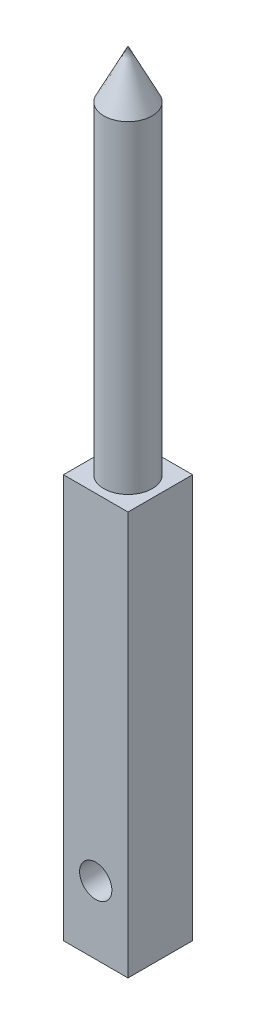
ISO-10303-21;
HEADER;
FILE_DESCRIPTION(('STEP AP214'),'2;1');
FILE_NAME('part.step','',(''),(''),'','','');
FILE_SCHEMA(('AUTOMOTIVE_DESIGN { 1 0 10303 214 1 1 1 1 }'));
ENDSEC;
DATA;
#1=APPLICATION_CONTEXT('core data for automotive mechanical design processes');
#2=APPLICATION_PROTOCOL_DEFINITION('international standard','automotive_design',2000,#1);
#3=PRODUCT_CONTEXT('',#1,'mechanical');
#4=PRODUCT('Part','Part','',(#3));
#5=PRODUCT_RELATED_PRODUCT_CATEGORY('part','',(#4));
#6=PRODUCT_DEFINITION_FORMATION('','',#4);
#7=PRODUCT_DEFINITION_CONTEXT('part definition',#1,'design');
#8=PRODUCT_DEFINITION('design','',#6,#7);
#9=PRODUCT_DEFINITION_SHAPE('','',#8);
#10=(LENGTH_UNIT() NAMED_UNIT(*) SI_UNIT(.MILLI.,.METRE.));
#11=(NAMED_UNIT(*) PLANE_ANGLE_UNIT() SI_UNIT($,.RADIAN.));
#12=(NAMED_UNIT(*) SI_UNIT($,.STERADIAN.) SOLID_ANGLE_UNIT());
#13=UNCERTAINTY_MEASURE_WITH_UNIT(LENGTH_MEASURE(1.E-05),#10,'distance_accuracy_value','');
#14=(GEOMETRIC_REPRESENTATION_CONTEXT(3) GLOBAL_UNCERTAINTY_ASSIGNED_CONTEXT((#13)) GLOBAL_UNIT_ASSIGNED_CONTEXT((#10,
#11,#12)) REPRESENTATION_CONTEXT('',''));
#15=CARTESIAN_POINT('',(0.,0.,0.));
#16=DIRECTION('',(0.,0.,1.));
#17=DIRECTION('',(1.,0.,0.));
#18=AXIS2_PLACEMENT_3D('',#15,#16,#17);
#19=CARTESIAN_POINT('',(0.,-90.,0.));
#20=DIRECTION('',(0.,1.,0.));
#21=DIRECTION('',(0.,0.,1.));
#22=AXIS2_PLACEMENT_3D('',#19,#20,#21);
#23=CYLINDRICAL_SURFACE('',#22,3.);
#24=CARTESIAN_POINT('',(0.,0.,0.));
#25=DIRECTION('',(0.,-1.,0.));
#26=DIRECTION('',(0.,0.,-1.));
#27=AXIS2_PLACEMENT_3D('',#24,#25,#26);
#28=CIRCLE('',#27,3.);
#29=CARTESIAN_POINT('',(0.,0.,3.));
#30=VERTEX_POINT('',#29);
#31=EDGE_CURVE('E41',#30,#30,#28,.T.);
#32=CARTESIAN_POINT('',(0.,-40.,0.));
#33=DIRECTION('',(0.,-1.,0.));
#34=DIRECTION('',(0.,0.,-1.));
#35=AXIS2_PLACEMENT_3D('',#32,#33,#34);
#36=CIRCLE('',#35,3.);
#37=CARTESIAN_POINT('',(0.,-40.,3.));
#38=VERTEX_POINT('',#37);
#39=EDGE_CURVE('E11',#38,#38,#36,.T.);
#40=CARTESIAN_POINT('',(0.,0.,3.));
#41=CARTESIAN_POINT('',(0.,-0.416666666666653,3.));
#42=CARTESIAN_POINT('',(0.,-0.83333333333332,3.));
#43=CARTESIAN_POINT('',(0.,-1.66666666666665,3.));
#44=CARTESIAN_POINT('',(0.,-2.08333333333332,3.));
#45=CARTESIAN_POINT('',(0.,-2.91666666666665,3.));
#46=CARTESIAN_POINT('',(0.,-3.33333333333332,3.));
#47=CARTESIAN_POINT('',(0.,-4.16666666666666,3.));
#48=CARTESIAN_POINT('',(0.,-4.58333333333332,3.));
#49=CARTESIAN_POINT('',(0.,-5.41666666666666,3.));
#50=CARTESIAN_POINT('',(0.,-5.83333333333333,3.));
#51=CARTESIAN_POINT('',(0.,-6.66666666666665,3.));
#52=CARTESIAN_POINT('',(0.,-7.08333333333332,3.));
#53=CARTESIAN_POINT('',(0.,-7.91666666666665,3.));
#54=CARTESIAN_POINT('',(0.,-8.33333333333331,3.));
#55=CARTESIAN_POINT('',(0.,-9.16666666666665,3.));
#56=CARTESIAN_POINT('',(0.,-9.58333333333331,3.));
#57=CARTESIAN_POINT('',(0.,-10.4166666666666,3.));
#58=CARTESIAN_POINT('',(0.,-10.8333333333333,3.));
#59=CARTESIAN_POINT('',(0.,-11.6666666666667,3.));
#60=CARTESIAN_POINT('',(0.,-12.0833333333333,3.));
#61=CARTESIAN_POINT('',(0.,-12.9166666666667,3.));
#62=CARTESIAN_POINT('',(0.,-13.3333333333333,3.));
#63=CARTESIAN_POINT('',(0.,-14.1666666666667,3.));
#64=CARTESIAN_POINT('',(0.,-14.5833333333333,3.));
#65=CARTESIAN_POINT('',(0.,-15.4166666666667,3.));
#66=CARTESIAN_POINT('',(0.,-15.8333333333333,3.));
#67=CARTESIAN_POINT('',(0.,-16.6666666666667,3.));
#68=CARTESIAN_POINT('',(0.,-17.0833333333333,3.));
#69=CARTESIAN_POINT('',(0.,-17.9166666666667,3.));
#70=CARTESIAN_POINT('',(0.,-18.3333333333333,3.));
#71=CARTESIAN_POINT('',(0.,-19.1666666666666,3.));
#72=CARTESIAN_POINT('',(0.,-19.5833333333333,3.));
#73=CARTESIAN_POINT('',(0.,-20.4166666666666,3.));
#74=CARTESIAN_POINT('',(0.,-20.8333333333333,3.));
#75=CARTESIAN_POINT('',(0.,-21.6666666666666,3.));
#76=CARTESIAN_POINT('',(0.,-22.0833333333333,3.));
#77=CARTESIAN_POINT('',(0.,-22.9166666666666,3.));
#78=CARTESIAN_POINT('',(0.,-23.3333333333333,3.));
#79=CARTESIAN_POINT('',(0.,-24.1666666666666,3.));
#80=CARTESIAN_POINT('',(0.,-24.5833333333333,3.));
#81=CARTESIAN_POINT('',(0.,-25.4166666666666,3.));
#82=CARTESIAN_POINT('',(0.,-25.8333333333333,3.));
#83=CARTESIAN_POINT('',(0.,-26.6666666666666,3.));
#84=CARTESIAN_POINT('',(0.,-27.0833333333333,3.));
#85=CARTESIAN_POINT('',(0.,-27.9166666666667,3.));
#86=CARTESIAN_POINT('',(0.,-28.3333333333333,3.));
#87=CARTESIAN_POINT('',(0.,-29.1666666666666,3.));
#88=CARTESIAN_POINT('',(0.,-29.5833333333333,3.));
#89=CARTESIAN_POINT('',(0.,-30.4166666666666,3.));
#90=CARTESIAN_POINT('',(0.,-30.8333333333333,3.));
#91=CARTESIAN_POINT('',(0.,-31.6666666666666,3.));
#92=CARTESIAN_POINT('',(0.,-32.0833333333333,3.));
#93=CARTESIAN_POINT('',(0.,-32.9166666666666,3.));
#94=CARTESIAN_POINT('',(0.,-33.3333333333333,3.));
#95=CARTESIAN_POINT('',(0.,-34.1666666666666,3.));
#96=CARTESIAN_POINT('',(0.,-34.5833333333333,3.));
#97=CARTESIAN_POINT('',(0.,-35.4166666666666,3.));
#98=CARTESIAN_POINT('',(0.,-35.8333333333333,3.));
#99=CARTESIAN_POINT('',(0.,-36.6666666666666,3.));
#100=CARTESIAN_POINT('',(0.,-37.0833333333333,3.));
#101=CARTESIAN_POINT('',(0.,-37.9166666666666,3.));
#102=CARTESIAN_POINT('',(0.,-38.3333333333333,3.));
#103=CARTESIAN_POINT('',(0.,-39.1666666666666,3.));
#104=CARTESIAN_POINT('',(0.,-39.5833333333333,3.));
#105=CARTESIAN_POINT('',(0.,-40.,3.));
#106=B_SPLINE_CURVE_WITH_KNOTS('',3,(#40,#41,#42,#43,#44,#45,#46,#47,#48,#49,#50,#51,#52,#53,
#54,#55,#56,#57,#58,#59,#60,#61,#62,#63,#64,#65,#66,#67,#68,#69,#70,#71,#72,#73,#74,#75,#76,#77,
#78,#79,#80,#81,#82,#83,#84,#85,#86,#87,#88,#89,#90,#91,#92,#93,#94,#95,#96,#97,#98,#99,#100,
#101,#102,#103,#104,#105),.UNSPECIFIED.,.F.,.F.,(4,2,2,2,2,2,2,2,2,2,2,2,2,2,2,2,2,2,2,2,2,2,2,
2,2,2,2,2,2,2,2,2,4),(0.,1.25,2.5,3.75,5.,6.25000000000001,7.49999999999999,8.74999999999999,
9.99999999999999,11.25,12.5,13.75,15.,16.25,17.5,18.75,20.,21.25,22.5,23.75,25.,26.25,27.5,
28.75,30.,31.25,32.5,33.75,35.,36.25,37.5,38.75,40.),.UNSPECIFIED.);
#107=EDGE_CURVE('BSEAM33',#30,#38,#106,.T.);
#108=ORIENTED_EDGE('',*,*,#31,.T.);
#109=ORIENTED_EDGE('',*,*,#39,.F.);
#110=ORIENTED_EDGE('',*,*,#107,.T.);
#111=ORIENTED_EDGE('',*,*,#107,.F.);
#112=EDGE_LOOP('',(#108,#110,#109,#111));
#113=FACE_BOUND('',#112,.T.);
#114=ADVANCED_FACE('F33',(#113),#23,.T.);
#115=CARTESIAN_POINT('',(0.,0.,0.));
#116=DIRECTION('',(0.,-1.,0.));
#117=DIRECTION('',(0.,0.,-1.));
#118=AXIS2_PLACEMENT_3D('',#115,#116,#117);
#119=CONICAL_SURFACE('',#118,3.,0.463647609000806);
#120=CARTESIAN_POINT('',(0.,6.,0.));
#121=VERTEX_POINT('',#120);
#122=VERTEX_LOOP('',#121);
#123=FACE_BOUND('',#122,.T.);
#124=ORIENTED_EDGE('',*,*,#31,.F.);
#125=EDGE_LOOP('',(#124));
#126=FACE_BOUND('',#125,.T.);
#127=ADVANCED_FACE('F35',(#123,#126),#119,.T.);
#128=CARTESIAN_POINT('',(-4.,-40.,-4.));
#129=DIRECTION('',(-1.,0.,0.));
#130=DIRECTION('',(0.,0.,1.));
#131=AXIS2_PLACEMENT_3D('',#128,#129,#130);
#132=PLANE('',#131);
#133=DIRECTION('',(0.,0.,-1.));
#134=VECTOR('',#133,1.);
#135=CARTESIAN_POINT('',(-4.,-90.,-4.));
#136=LINE('',#135,#134);
#137=CARTESIAN_POINT('',(-4.,-90.,4.));
#138=VERTEX_POINT('',#137);
#139=CARTESIAN_POINT('',(-4.,-90.,-4.));
#140=VERTEX_POINT('',#139);
#141=EDGE_CURVE('E106',#138,#140,#136,.T.);
#142=ORIENTED_EDGE('',*,*,#141,.F.);
#143=DIRECTION('',(0.,-1.,0.));
#144=VECTOR('',#143,1.);
#145=CARTESIAN_POINT('',(-4.,-40.,4.));
#146=LINE('',#145,#144);
#147=CARTESIAN_POINT('',(-4.,-40.,4.));
#148=VERTEX_POINT('',#147);
#149=EDGE_CURVE('E52',#148,#138,#146,.T.);
#150=ORIENTED_EDGE('',*,*,#149,.F.);
#151=DIRECTION('',(0.,0.,-1.));
#152=VECTOR('',#151,1.);
#153=CARTESIAN_POINT('',(-4.,-40.,-4.));
#154=LINE('',#153,#152);
#155=CARTESIAN_POINT('',(-4.,-40.,-4.));
#156=VERTEX_POINT('',#155);
#157=EDGE_CURVE('E99',#148,#156,#154,.T.);
#158=ORIENTED_EDGE('',*,*,#157,.T.);
#159=DIRECTION('',(0.,-1.,0.));
#160=VECTOR('',#159,1.);
#161=CARTESIAN_POINT('',(-4.,-40.,-4.));
#162=LINE('',#161,#160);
#163=EDGE_CURVE('E77',#156,#140,#162,.T.);
#164=ORIENTED_EDGE('',*,*,#163,.T.);
#165=EDGE_LOOP('',(#142,#150,#158,#164));
#166=FACE_BOUND('',#165,.T.);
#167=ADVANCED_FACE('F123',(#166),#132,.T.);
#168=CARTESIAN_POINT('',(4.,-40.,4.));
#169=DIRECTION('',(0.,0.,1.));
#170=DIRECTION('',(1.,0.,0.));
#171=AXIS2_PLACEMENT_3D('',#168,#169,#170);
#172=PLANE('',#171);
#173=CARTESIAN_POINT('',(0.,-81.5747309251882,4.));
#174=DIRECTION('',(0.,0.,1.));
#175=DIRECTION('',(1.,0.,0.));
#176=AXIS2_PLACEMENT_3D('',#173,#174,#175);
#177=CIRCLE('',#176,2.);
#178=CARTESIAN_POINT('',(2.,-81.5747309251882,4.));
#179=VERTEX_POINT('',#178);
#180=EDGE_CURVE('E110',#179,#179,#177,.T.);
#181=ORIENTED_EDGE('',*,*,#180,.F.);
#182=EDGE_LOOP('',(#181));
#183=FACE_BOUND('',#182,.T.);
#184=DIRECTION('',(-1.,0.,0.));
#185=VECTOR('',#184,1.);
#186=CARTESIAN_POINT('',(4.,-90.,4.));
#187=LINE('',#186,#185);
#188=CARTESIAN_POINT('',(4.,-90.,4.));
#189=VERTEX_POINT('',#188);
#190=EDGE_CURVE('E101',#189,#138,#187,.T.);
#191=ORIENTED_EDGE('',*,*,#190,.F.);
#192=DIRECTION('',(0.,-1.,0.));
#193=VECTOR('',#192,1.);
#194=CARTESIAN_POINT('',(4.,-40.,4.));
#195=LINE('',#194,#193);
#196=CARTESIAN_POINT('',(4.,-40.,4.));
#197=VERTEX_POINT('',#196);
#198=EDGE_CURVE('E91',#197,#189,#195,.T.);
#199=ORIENTED_EDGE('',*,*,#198,.F.);
#200=DIRECTION('',(-1.,0.,0.));
#201=VECTOR('',#200,1.);
#202=CARTESIAN_POINT('',(4.,-40.,4.));
#203=LINE('',#202,#201);
#204=EDGE_CURVE('E96',#197,#148,#203,.T.);
#205=ORIENTED_EDGE('',*,*,#204,.T.);
#206=ORIENTED_EDGE('',*,*,#149,.T.);
#207=EDGE_LOOP('',(#191,#199,#205,#206));
#208=FACE_BOUND('',#207,.T.);
#209=ADVANCED_FACE('F128',(#183,#208),#172,.T.);
#210=CARTESIAN_POINT('',(4.,-40.,-4.));
#211=DIRECTION('',(1.,0.,0.));
#212=DIRECTION('',(0.,0.,-1.));
#213=AXIS2_PLACEMENT_3D('',#210,#211,#212);
#214=PLANE('',#213);
#215=DIRECTION('',(0.,0.,1.));
#216=VECTOR('',#215,1.);
#217=CARTESIAN_POINT('',(4.,-90.,-4.));
#218=LINE('',#217,#216);
#219=CARTESIAN_POINT('',(4.,-90.,-4.));
#220=VERTEX_POINT('',#219);
#221=EDGE_CURVE('E89',#220,#189,#218,.T.);
#222=ORIENTED_EDGE('',*,*,#221,.F.);
#223=DIRECTION('',(0.,-1.,0.));
#224=VECTOR('',#223,1.);
#225=CARTESIAN_POINT('',(4.,-40.,-4.));
#226=LINE('',#225,#224);
#227=CARTESIAN_POINT('',(4.,-40.,-4.));
#228=VERTEX_POINT('',#227);
#229=EDGE_CURVE('E83',#228,#220,#226,.T.);
#230=ORIENTED_EDGE('',*,*,#229,.F.);
#231=DIRECTION('',(0.,0.,1.));
#232=VECTOR('',#231,1.);
#233=CARTESIAN_POINT('',(4.,-40.,-4.));
#234=LINE('',#233,#232);
#235=EDGE_CURVE('E86',#228,#197,#234,.T.);
#236=ORIENTED_EDGE('',*,*,#235,.T.);
#237=ORIENTED_EDGE('',*,*,#198,.T.);
#238=EDGE_LOOP('',(#222,#230,#236,#237));
#239=FACE_BOUND('',#238,.T.);
#240=ADVANCED_FACE('F85',(#239),#214,.T.);
#241=CARTESIAN_POINT('',(4.,-40.,-4.));
#242=DIRECTION('',(0.,0.,-1.));
#243=DIRECTION('',(-1.,0.,0.));
#244=AXIS2_PLACEMENT_3D('',#241,#242,#243);
#245=PLANE('',#244);
#246=CARTESIAN_POINT('',(0.,-81.5747309251882,-4.));
#247=DIRECTION('',(0.,0.,-1.));
#248=DIRECTION('',(-1.,0.,0.));
#249=AXIS2_PLACEMENT_3D('',#246,#247,#248);
#250=CIRCLE('',#249,2.);
#251=CARTESIAN_POINT('',(-2.,-81.5747309251882,-4.));
#252=VERTEX_POINT('',#251);
#253=EDGE_CURVE('E158',#252,#252,#250,.T.);
#254=ORIENTED_EDGE('',*,*,#253,.F.);
#255=EDGE_LOOP('',(#254));
#256=FACE_BOUND('',#255,.T.);
#257=DIRECTION('',(1.,0.,0.));
#258=VECTOR('',#257,1.);
#259=CARTESIAN_POINT('',(4.,-90.,-4.));
#260=LINE('',#259,#258);
#261=EDGE_CURVE('E109',#140,#220,#260,.T.);
#262=ORIENTED_EDGE('',*,*,#261,.F.);
#263=ORIENTED_EDGE('',*,*,#163,.F.);
#264=DIRECTION('',(1.,0.,0.));
#265=VECTOR('',#264,1.);
#266=CARTESIAN_POINT('',(4.,-40.,-4.));
#267=LINE('',#266,#265);
#268=EDGE_CURVE('E95',#156,#228,#267,.T.);
#269=ORIENTED_EDGE('',*,*,#268,.T.);
#270=ORIENTED_EDGE('',*,*,#229,.T.);
#271=EDGE_LOOP('',(#262,#263,#269,#270));
#272=FACE_BOUND('',#271,.T.);
#273=ADVANCED_FACE('F98',(#256,#272),#245,.T.);
#274=CARTESIAN_POINT('',(0.,-40.,0.));
#275=DIRECTION('',(0.,-1.,0.));
#276=DIRECTION('',(0.,0.,-1.));
#277=AXIS2_PLACEMENT_3D('',#274,#275,#276);
#278=PLANE('',#277);
#279=ORIENTED_EDGE('',*,*,#39,.T.);
#280=EDGE_LOOP('',(#279));
#281=FACE_BOUND('',#280,.T.);
#282=ORIENTED_EDGE('',*,*,#157,.F.);
#283=ORIENTED_EDGE('',*,*,#204,.F.);
#284=ORIENTED_EDGE('',*,*,#235,.F.);
#285=ORIENTED_EDGE('',*,*,#268,.F.);
#286=EDGE_LOOP('',(#282,#283,#284,#285));
#287=FACE_BOUND('',#286,.T.);
#288=ADVANCED_FACE('F94',(#281,#287),#278,.F.);
#289=CARTESIAN_POINT('',(0.,-90.,0.));
#290=DIRECTION('',(0.,-1.,0.));
#291=DIRECTION('',(0.,0.,-1.));
#292=AXIS2_PLACEMENT_3D('',#289,#290,#291);
#293=PLANE('',#292);
#294=ORIENTED_EDGE('',*,*,#141,.T.);
#295=ORIENTED_EDGE('',*,*,#261,.T.);
#296=ORIENTED_EDGE('',*,*,#221,.T.);
#297=ORIENTED_EDGE('',*,*,#190,.T.);
#298=EDGE_LOOP('',(#294,#295,#296,#297));
#299=FACE_BOUND('',#298,.T.);
#300=ADVANCED_FACE('F133',(#299),#293,.T.);
#301=CARTESIAN_POINT('',(0.,-81.5747309251882,6.));
#302=DIRECTION('',(0.,0.,-1.));
#303=DIRECTION('',(-1.,0.,0.));
#304=AXIS2_PLACEMENT_3D('',#301,#302,#303);
#305=CYLINDRICAL_SURFACE('',#304,2.);
#306=ORIENTED_EDGE('',*,*,#180,.T.);
#307=EDGE_LOOP('',(#306));
#308=FACE_BOUND('',#307,.T.);
#309=ORIENTED_EDGE('',*,*,#253,.T.);
#310=EDGE_LOOP('',(#309));
#311=FACE_BOUND('',#310,.T.);
#312=ADVANCED_FACE('F135',(#308,#311),#305,.F.);
#313=CLOSED_SHELL('',(#114,#127,#167,#209,#240,#273,#288,#300,#312));
#314=MANIFOLD_SOLID_BREP('B2',#313);
#315=ADVANCED_BREP_SHAPE_REPRESENTATION('',(#18,#314),#14);
#316=SHAPE_DEFINITION_REPRESENTATION(#9,#315);
ENDSEC;
END-ISO-10303-21;
